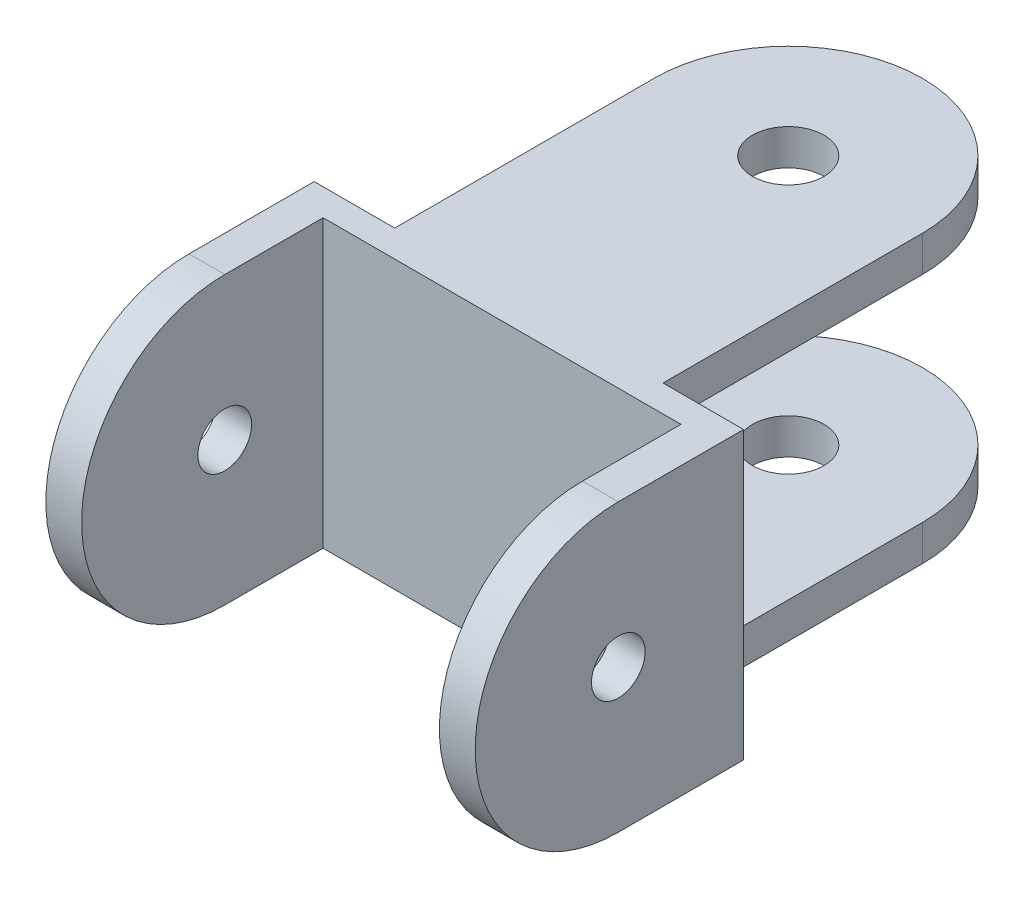
ISO-10303-21;
HEADER;
FILE_DESCRIPTION(('STEP AP214'),'2;1');
FILE_NAME('part.step','',(''),(''),'','','');
FILE_SCHEMA(('AUTOMOTIVE_DESIGN { 1 0 10303 214 1 1 1 1 }'));
ENDSEC;
DATA;
#1=APPLICATION_CONTEXT('core data for automotive mechanical design processes');
#2=APPLICATION_PROTOCOL_DEFINITION('international standard','automotive_design',2000,#1);
#3=PRODUCT_CONTEXT('',#1,'mechanical');
#4=PRODUCT('Part','Part','',(#3));
#5=PRODUCT_RELATED_PRODUCT_CATEGORY('part','',(#4));
#6=PRODUCT_DEFINITION_FORMATION('','',#4);
#7=PRODUCT_DEFINITION_CONTEXT('part definition',#1,'design');
#8=PRODUCT_DEFINITION('design','',#6,#7);
#9=PRODUCT_DEFINITION_SHAPE('','',#8);
#10=(LENGTH_UNIT() NAMED_UNIT(*) SI_UNIT(.MILLI.,.METRE.));
#11=(NAMED_UNIT(*) PLANE_ANGLE_UNIT() SI_UNIT($,.RADIAN.));
#12=(NAMED_UNIT(*) SI_UNIT($,.STERADIAN.) SOLID_ANGLE_UNIT());
#13=UNCERTAINTY_MEASURE_WITH_UNIT(LENGTH_MEASURE(1.E-05),#10,'distance_accuracy_value','');
#14=(GEOMETRIC_REPRESENTATION_CONTEXT(3) GLOBAL_UNCERTAINTY_ASSIGNED_CONTEXT((#13)) GLOBAL_UNIT_ASSIGNED_CONTEXT((#10,
#11,#12)) REPRESENTATION_CONTEXT('',''));
#15=CARTESIAN_POINT('',(0.,0.,0.));
#16=DIRECTION('',(0.,0.,1.));
#17=DIRECTION('',(1.,0.,0.));
#18=AXIS2_PLACEMENT_3D('',#15,#16,#17);
#19=CARTESIAN_POINT('',(-24.,0.,32.));
#20=DIRECTION('',(1.,0.,0.));
#21=DIRECTION('',(0.,1.,0.));
#22=AXIS2_PLACEMENT_3D('',#19,#20,#21);
#23=PLANE('',#22);
#24=CARTESIAN_POINT('',(-24.,-3.12033137055574E-13,43.));
#25=DIRECTION('',(-1.,0.,0.));
#26=DIRECTION('',(0.,-1.,0.));
#27=AXIS2_PLACEMENT_3D('',#24,#25,#26);
#28=CIRCLE('',#27,3.);
#29=CARTESIAN_POINT('',(-24.,-3.00000000000031,43.));
#30=VERTEX_POINT('',#29);
#31=EDGE_CURVE('E374',#30,#30,#28,.F.);
#32=ORIENTED_EDGE('',*,*,#31,.T.);
#33=EDGE_LOOP('',(#32));
#34=FACE_BOUND('',#33,.T.);
#35=DIRECTION('',(0.,0.,-1.));
#36=VECTOR('',#35,1.);
#37=CARTESIAN_POINT('',(-24.,-16.,32.));
#38=LINE('',#37,#36);
#39=CARTESIAN_POINT('',(-24.,-16.,43.));
#40=VERTEX_POINT('',#39);
#41=CARTESIAN_POINT('',(-24.,-16.,29.));
#42=VERTEX_POINT('',#41);
#43=EDGE_CURVE('E224',#40,#42,#38,.T.);
#44=ORIENTED_EDGE('',*,*,#43,.F.);
#45=CARTESIAN_POINT('',(-24.,-3.12033137055574E-13,43.));
#46=DIRECTION('',(-1.,0.,0.));
#47=DIRECTION('',(0.,-1.,0.));
#48=AXIS2_PLACEMENT_3D('',#45,#46,#47);
#49=CIRCLE('',#48,16.);
#50=CARTESIAN_POINT('',(-24.,16.,43.));
#51=VERTEX_POINT('',#50);
#52=EDGE_CURVE('E208',#51,#40,#49,.F.);
#53=ORIENTED_EDGE('',*,*,#52,.F.);
#54=DIRECTION('',(0.,0.,-1.));
#55=VECTOR('',#54,1.);
#56=CARTESIAN_POINT('',(-24.,16.,32.));
#57=LINE('',#56,#55);
#58=CARTESIAN_POINT('',(-24.,16.,29.));
#59=VERTEX_POINT('',#58);
#60=EDGE_CURVE('E226',#51,#59,#57,.T.);
#61=ORIENTED_EDGE('',*,*,#60,.T.);
#62=DIRECTION('',(0.,-1.,0.));
#63=VECTOR('',#62,1.);
#64=CARTESIAN_POINT('',(-24.,0.,29.));
#65=LINE('',#64,#63);
#66=EDGE_CURVE('E336',#59,#42,#65,.T.);
#67=ORIENTED_EDGE('',*,*,#66,.T.);
#68=EDGE_LOOP('',(#44,#53,#61,#67));
#69=FACE_BOUND('',#68,.T.);
#70=ADVANCED_FACE('F81',(#34,#69),#23,.F.);
#71=CARTESIAN_POINT('',(24.,0.,32.));
#72=DIRECTION('',(1.,0.,0.));
#73=DIRECTION('',(0.,1.,0.));
#74=AXIS2_PLACEMENT_3D('',#71,#72,#73);
#75=PLANE('',#74);
#76=CARTESIAN_POINT('',(24.,-3.01624796199713E-13,43.));
#77=DIRECTION('',(-1.,0.,0.));
#78=DIRECTION('',(0.,-1.,0.));
#79=AXIS2_PLACEMENT_3D('',#76,#77,#78);
#80=CIRCLE('',#79,3.);
#81=CARTESIAN_POINT('',(24.,-3.0000000000003,43.));
#82=VERTEX_POINT('',#81);
#83=EDGE_CURVE('E377',#82,#82,#80,.F.);
#84=ORIENTED_EDGE('',*,*,#83,.F.);
#85=EDGE_LOOP('',(#84));
#86=FACE_BOUND('',#85,.T.);
#87=CARTESIAN_POINT('',(24.,-3.01624796199713E-13,43.));
#88=DIRECTION('',(-1.,0.,0.));
#89=DIRECTION('',(0.,-1.,0.));
#90=AXIS2_PLACEMENT_3D('',#87,#88,#89);
#91=CIRCLE('',#90,16.);
#92=CARTESIAN_POINT('',(24.,16.,43.));
#93=VERTEX_POINT('',#92);
#94=CARTESIAN_POINT('',(24.,-16.,43.));
#95=VERTEX_POINT('',#94);
#96=EDGE_CURVE('E197',#93,#95,#91,.F.);
#97=ORIENTED_EDGE('',*,*,#96,.T.);
#98=DIRECTION('',(0.,0.,-1.));
#99=VECTOR('',#98,1.);
#100=CARTESIAN_POINT('',(24.,-16.,32.));
#101=LINE('',#100,#99);
#102=CARTESIAN_POINT('',(24.,-16.,29.));
#103=VERTEX_POINT('',#102);
#104=EDGE_CURVE('E202',#95,#103,#101,.T.);
#105=ORIENTED_EDGE('',*,*,#104,.T.);
#106=DIRECTION('',(0.,-1.,0.));
#107=VECTOR('',#106,1.);
#108=CARTESIAN_POINT('',(24.,0.,29.));
#109=LINE('',#108,#107);
#110=CARTESIAN_POINT('',(24.,16.,29.));
#111=VERTEX_POINT('',#110);
#112=EDGE_CURVE('E348',#111,#103,#109,.T.);
#113=ORIENTED_EDGE('',*,*,#112,.F.);
#114=DIRECTION('',(0.,0.,-1.));
#115=VECTOR('',#114,1.);
#116=CARTESIAN_POINT('',(24.,16.,32.));
#117=LINE('',#116,#115);
#118=EDGE_CURVE('E204',#93,#111,#117,.T.);
#119=ORIENTED_EDGE('',*,*,#118,.F.);
#120=EDGE_LOOP('',(#97,#105,#113,#119));
#121=FACE_BOUND('',#120,.T.);
#122=ADVANCED_FACE('F199',(#86,#121),#75,.T.);
#123=CARTESIAN_POINT('',(20.,0.,59.));
#124=DIRECTION('',(1.,0.,0.));
#125=DIRECTION('',(0.,1.,0.));
#126=AXIS2_PLACEMENT_3D('',#123,#124,#125);
#127=PLANE('',#126);
#128=CARTESIAN_POINT('',(20.,-3.02492157937702E-13,43.));
#129=DIRECTION('',(1.,0.,0.));
#130=DIRECTION('',(0.,1.,0.));
#131=AXIS2_PLACEMENT_3D('',#128,#129,#130);
#132=CIRCLE('',#131,3.);
#133=CARTESIAN_POINT('',(20.,-3.0000000000003,43.));
#134=VERTEX_POINT('',#133);
#135=EDGE_CURVE('E370',#134,#134,#132,.F.);
#136=ORIENTED_EDGE('',*,*,#135,.F.);
#137=EDGE_LOOP('',(#136));
#138=FACE_BOUND('',#137,.T.);
#139=DIRECTION('',(0.,0.,-1.));
#140=VECTOR('',#139,1.);
#141=CARTESIAN_POINT('',(20.,-16.,59.));
#142=LINE('',#141,#140);
#143=CARTESIAN_POINT('',(20.,-16.,43.));
#144=VERTEX_POINT('',#143);
#145=CARTESIAN_POINT('',(20.,-16.,32.));
#146=VERTEX_POINT('',#145);
#147=EDGE_CURVE('E357',#144,#146,#142,.T.);
#148=ORIENTED_EDGE('',*,*,#147,.F.);
#149=CARTESIAN_POINT('',(20.,-3.02492157937702E-13,43.));
#150=DIRECTION('',(1.,0.,0.));
#151=DIRECTION('',(0.,1.,0.));
#152=AXIS2_PLACEMENT_3D('',#149,#150,#151);
#153=CIRCLE('',#152,16.);
#154=CARTESIAN_POINT('',(20.,16.,43.));
#155=VERTEX_POINT('',#154);
#156=EDGE_CURVE('E214',#144,#155,#153,.F.);
#157=ORIENTED_EDGE('',*,*,#156,.T.);
#158=DIRECTION('',(0.,0.,-1.));
#159=VECTOR('',#158,1.);
#160=CARTESIAN_POINT('',(20.,16.,59.));
#161=LINE('',#160,#159);
#162=CARTESIAN_POINT('',(20.,16.,32.));
#163=VERTEX_POINT('',#162);
#164=EDGE_CURVE('E359',#155,#163,#161,.T.);
#165=ORIENTED_EDGE('',*,*,#164,.T.);
#166=DIRECTION('',(0.,1.,0.));
#167=VECTOR('',#166,1.);
#168=CARTESIAN_POINT('',(20.,0.,32.));
#169=LINE('',#168,#167);
#170=EDGE_CURVE('E12',#146,#163,#169,.T.);
#171=ORIENTED_EDGE('',*,*,#170,.F.);
#172=EDGE_LOOP('',(#148,#157,#165,#171));
#173=FACE_BOUND('',#172,.T.);
#174=ADVANCED_FACE('F392',(#138,#173),#127,.F.);
#175=CARTESIAN_POINT('',(-20.,0.,59.));
#176=DIRECTION('',(1.,0.,0.));
#177=DIRECTION('',(0.,1.,0.));
#178=AXIS2_PLACEMENT_3D('',#175,#176,#177);
#179=PLANE('',#178);
#180=CARTESIAN_POINT('',(-20.,-3.11165775317586E-13,43.));
#181=DIRECTION('',(1.,0.,0.));
#182=DIRECTION('',(0.,1.,0.));
#183=AXIS2_PLACEMENT_3D('',#180,#181,#182);
#184=CIRCLE('',#183,3.);
#185=CARTESIAN_POINT('',(-20.,-3.00000000000031,43.));
#186=VERTEX_POINT('',#185);
#187=EDGE_CURVE('E85',#186,#186,#184,.F.);
#188=ORIENTED_EDGE('',*,*,#187,.T.);
#189=EDGE_LOOP('',(#188));
#190=FACE_BOUND('',#189,.T.);
#191=CARTESIAN_POINT('',(-20.,-3.11165775317586E-13,43.));
#192=DIRECTION('',(1.,0.,0.));
#193=DIRECTION('',(0.,1.,0.));
#194=AXIS2_PLACEMENT_3D('',#191,#192,#193);
#195=CIRCLE('',#194,16.);
#196=CARTESIAN_POINT('',(-20.,-16.,43.));
#197=VERTEX_POINT('',#196);
#198=CARTESIAN_POINT('',(-20.,16.,43.));
#199=VERTEX_POINT('',#198);
#200=EDGE_CURVE('E366',#197,#199,#195,.F.);
#201=ORIENTED_EDGE('',*,*,#200,.F.);
#202=DIRECTION('',(0.,0.,-1.));
#203=VECTOR('',#202,1.);
#204=CARTESIAN_POINT('',(-20.,-16.,59.));
#205=LINE('',#204,#203);
#206=CARTESIAN_POINT('',(-20.,-16.,32.));
#207=VERTEX_POINT('',#206);
#208=EDGE_CURVE('E105',#197,#207,#205,.T.);
#209=ORIENTED_EDGE('',*,*,#208,.T.);
#210=DIRECTION('',(0.,1.,0.));
#211=VECTOR('',#210,1.);
#212=CARTESIAN_POINT('',(-20.,0.,32.));
#213=LINE('',#212,#211);
#214=CARTESIAN_POINT('',(-20.,16.,32.));
#215=VERTEX_POINT('',#214);
#216=EDGE_CURVE('E361',#207,#215,#213,.T.);
#217=ORIENTED_EDGE('',*,*,#216,.T.);
#218=DIRECTION('',(0.,0.,-1.));
#219=VECTOR('',#218,1.);
#220=CARTESIAN_POINT('',(-20.,16.,59.));
#221=LINE('',#220,#219);
#222=EDGE_CURVE('E97',#199,#215,#221,.T.);
#223=ORIENTED_EDGE('',*,*,#222,.F.);
#224=EDGE_LOOP('',(#201,#209,#217,#223));
#225=FACE_BOUND('',#224,.T.);
#226=ADVANCED_FACE('F387',(#190,#225),#179,.T.);
#227=CARTESIAN_POINT('',(15.,-16.,29.));
#228=DIRECTION('',(0.,1.,0.));
#229=DIRECTION('',(0.,0.,1.));
#230=AXIS2_PLACEMENT_3D('',#227,#228,#229);
#231=PLANE('',#230);
#232=CARTESIAN_POINT('',(0.,-16.,0.));
#233=DIRECTION('',(0.,1.,0.));
#234=DIRECTION('',(0.,0.,1.));
#235=AXIS2_PLACEMENT_3D('',#232,#233,#234);
#236=CIRCLE('',#235,4.);
#237=CARTESIAN_POINT('',(0.,-16.,4.));
#238=VERTEX_POINT('',#237);
#239=EDGE_CURVE('E234',#238,#238,#236,.T.);
#240=ORIENTED_EDGE('',*,*,#239,.T.);
#241=EDGE_LOOP('',(#240));
#242=FACE_BOUND('',#241,.T.);
#243=DIRECTION('',(-1.,0.,0.));
#244=VECTOR('',#243,1.);
#245=CARTESIAN_POINT('',(24.,-16.,43.));
#246=LINE('',#245,#244);
#247=EDGE_CURVE('E217',#197,#40,#246,.T.);
#248=ORIENTED_EDGE('',*,*,#247,.T.);
#249=ORIENTED_EDGE('',*,*,#43,.T.);
#250=DIRECTION('',(1.,0.,0.));
#251=VECTOR('',#250,1.);
#252=CARTESIAN_POINT('',(0.,-16.,29.));
#253=LINE('',#252,#251);
#254=CARTESIAN_POINT('',(-15.,-16.,29.));
#255=VERTEX_POINT('',#254);
#256=EDGE_CURVE('E332',#42,#255,#253,.T.);
#257=ORIENTED_EDGE('',*,*,#256,.T.);
#258=DIRECTION('',(0.,0.,-1.));
#259=VECTOR('',#258,1.);
#260=CARTESIAN_POINT('',(-15.,-16.,29.));
#261=LINE('',#260,#259);
#262=CARTESIAN_POINT('',(-15.,-16.,0.));
#263=VERTEX_POINT('',#262);
#264=EDGE_CURVE('E271',#255,#263,#261,.T.);
#265=ORIENTED_EDGE('',*,*,#264,.T.);
#266=CARTESIAN_POINT('',(0.,-16.,0.));
#267=DIRECTION('',(0.,1.,0.));
#268=DIRECTION('',(0.,0.,1.));
#269=AXIS2_PLACEMENT_3D('',#266,#267,#268);
#270=CIRCLE('',#269,15.);
#271=CARTESIAN_POINT('',(15.,-16.,0.));
#272=VERTEX_POINT('',#271);
#273=EDGE_CURVE('E240',#272,#263,#270,.T.);
#274=ORIENTED_EDGE('',*,*,#273,.F.);
#275=DIRECTION('',(0.,0.,-1.));
#276=VECTOR('',#275,1.);
#277=CARTESIAN_POINT('',(15.,-16.,29.));
#278=LINE('',#277,#276);
#279=CARTESIAN_POINT('',(15.,-16.,29.));
#280=VERTEX_POINT('',#279);
#281=EDGE_CURVE('E266',#280,#272,#278,.T.);
#282=ORIENTED_EDGE('',*,*,#281,.F.);
#283=EDGE_CURVE('E222',#280,#103,#253,.T.);
#284=ORIENTED_EDGE('',*,*,#283,.T.);
#285=ORIENTED_EDGE('',*,*,#104,.F.);
#286=EDGE_CURVE('E211',#95,#144,#246,.T.);
#287=ORIENTED_EDGE('',*,*,#286,.T.);
#288=ORIENTED_EDGE('',*,*,#147,.T.);
#289=DIRECTION('',(1.,0.,0.));
#290=VECTOR('',#289,1.);
#291=CARTESIAN_POINT('',(0.,-16.,32.));
#292=LINE('',#291,#290);
#293=EDGE_CURVE('E228',#207,#146,#292,.T.);
#294=ORIENTED_EDGE('',*,*,#293,.F.);
#295=ORIENTED_EDGE('',*,*,#208,.F.);
#296=EDGE_LOOP('',(#248,#249,#257,#265,#274,#282,#284,#285,#287,#288,#294,#295));
#297=FACE_BOUND('',#296,.T.);
#298=ADVANCED_FACE('F220',(#242,#297),#231,.F.);
#299=CARTESIAN_POINT('',(0.,16.,0.));
#300=DIRECTION('',(0.,1.,0.));
#301=DIRECTION('',(0.,0.,1.));
#302=AXIS2_PLACEMENT_3D('',#299,#300,#301);
#303=PLANE('',#302);
#304=CARTESIAN_POINT('',(0.,16.,0.));
#305=DIRECTION('',(0.,1.,0.));
#306=DIRECTION('',(0.,0.,1.));
#307=AXIS2_PLACEMENT_3D('',#304,#305,#306);
#308=CIRCLE('',#307,4.);
#309=CARTESIAN_POINT('',(0.,16.,4.));
#310=VERTEX_POINT('',#309);
#311=EDGE_CURVE('E274',#310,#310,#308,.T.);
#312=ORIENTED_EDGE('',*,*,#311,.F.);
#313=EDGE_LOOP('',(#312));
#314=FACE_BOUND('',#313,.T.);
#315=ORIENTED_EDGE('',*,*,#60,.F.);
#316=DIRECTION('',(-1.,0.,0.));
#317=VECTOR('',#316,1.);
#318=CARTESIAN_POINT('',(24.,16.,43.));
#319=LINE('',#318,#317);
#320=EDGE_CURVE('E207',#199,#51,#319,.T.);
#321=ORIENTED_EDGE('',*,*,#320,.F.);
#322=ORIENTED_EDGE('',*,*,#222,.T.);
#323=DIRECTION('',(1.,0.,0.));
#324=VECTOR('',#323,1.);
#325=CARTESIAN_POINT('',(0.,16.,32.));
#326=LINE('',#325,#324);
#327=EDGE_CURVE('E351',#215,#163,#326,.T.);
#328=ORIENTED_EDGE('',*,*,#327,.T.);
#329=ORIENTED_EDGE('',*,*,#164,.F.);
#330=EDGE_CURVE('E368',#93,#155,#319,.T.);
#331=ORIENTED_EDGE('',*,*,#330,.F.);
#332=ORIENTED_EDGE('',*,*,#118,.T.);
#333=DIRECTION('',(1.,0.,0.));
#334=VECTOR('',#333,1.);
#335=CARTESIAN_POINT('',(0.,16.,29.));
#336=LINE('',#335,#334);
#337=CARTESIAN_POINT('',(15.,16.,29.));
#338=VERTEX_POINT('',#337);
#339=EDGE_CURVE('E338',#338,#111,#336,.T.);
#340=ORIENTED_EDGE('',*,*,#339,.F.);
#341=DIRECTION('',(0.,0.,-1.));
#342=VECTOR('',#341,1.);
#343=CARTESIAN_POINT('',(15.,16.,25.));
#344=LINE('',#343,#342);
#345=CARTESIAN_POINT('',(15.,16.,0.));
#346=VERTEX_POINT('',#345);
#347=EDGE_CURVE('E287',#338,#346,#344,.T.);
#348=ORIENTED_EDGE('',*,*,#347,.T.);
#349=CARTESIAN_POINT('',(0.,16.,0.));
#350=DIRECTION('',(0.,1.,0.));
#351=DIRECTION('',(0.,0.,1.));
#352=AXIS2_PLACEMENT_3D('',#349,#350,#351);
#353=CIRCLE('',#352,15.);
#354=CARTESIAN_POINT('',(-15.,16.,0.));
#355=VERTEX_POINT('',#354);
#356=EDGE_CURVE('E280',#346,#355,#353,.T.);
#357=ORIENTED_EDGE('',*,*,#356,.T.);
#358=DIRECTION('',(0.,0.,1.));
#359=VECTOR('',#358,1.);
#360=CARTESIAN_POINT('',(-15.,16.,0.));
#361=LINE('',#360,#359);
#362=CARTESIAN_POINT('',(-15.,16.,29.));
#363=VERTEX_POINT('',#362);
#364=EDGE_CURVE('E283',#355,#363,#361,.T.);
#365=ORIENTED_EDGE('',*,*,#364,.T.);
#366=EDGE_CURVE('E334',#59,#363,#336,.T.);
#367=ORIENTED_EDGE('',*,*,#366,.F.);
#368=EDGE_LOOP('',(#315,#321,#322,#328,#329,#331,#332,#340,#348,#357,#365,#367));
#369=FACE_BOUND('',#368,.T.);
#370=ADVANCED_FACE('F340',(#314,#369),#303,.T.);
#371=CARTESIAN_POINT('',(0.,0.,32.));
#372=DIRECTION('',(0.,0.,1.));
#373=DIRECTION('',(1.,0.,0.));
#374=AXIS2_PLACEMENT_3D('',#371,#372,#373);
#375=PLANE('',#374);
#376=ORIENTED_EDGE('',*,*,#216,.F.);
#377=ORIENTED_EDGE('',*,*,#293,.T.);
#378=ORIENTED_EDGE('',*,*,#170,.T.);
#379=ORIENTED_EDGE('',*,*,#327,.F.);
#380=EDGE_LOOP('',(#376,#377,#378,#379));
#381=FACE_BOUND('',#380,.T.);
#382=ADVANCED_FACE('F389',(#381),#375,.T.);
#383=CARTESIAN_POINT('',(0.,12.,0.));
#384=DIRECTION('',(0.,1.,0.));
#385=DIRECTION('',(0.,0.,1.));
#386=AXIS2_PLACEMENT_3D('',#383,#384,#385);
#387=PLANE('',#386);
#388=CARTESIAN_POINT('',(0.,12.,0.));
#389=DIRECTION('',(0.,1.,0.));
#390=DIRECTION('',(0.,0.,1.));
#391=AXIS2_PLACEMENT_3D('',#388,#389,#390);
#392=CIRCLE('',#391,15.);
#393=CARTESIAN_POINT('',(15.,12.,0.));
#394=VERTEX_POINT('',#393);
#395=CARTESIAN_POINT('',(-15.,12.,0.));
#396=VERTEX_POINT('',#395);
#397=EDGE_CURVE('E277',#394,#396,#392,.T.);
#398=ORIENTED_EDGE('',*,*,#397,.F.);
#399=DIRECTION('',(0.,0.,-1.));
#400=VECTOR('',#399,1.);
#401=CARTESIAN_POINT('',(15.,12.,25.));
#402=LINE('',#401,#400);
#403=CARTESIAN_POINT('',(15.,12.,25.));
#404=VERTEX_POINT('',#403);
#405=EDGE_CURVE('E284',#404,#394,#402,.T.);
#406=ORIENTED_EDGE('',*,*,#405,.F.);
#407=DIRECTION('',(1.,0.,0.));
#408=VECTOR('',#407,1.);
#409=CARTESIAN_POINT('',(-15.,12.,25.));
#410=LINE('',#409,#408);
#411=CARTESIAN_POINT('',(-15.,12.,25.));
#412=VERTEX_POINT('',#411);
#413=EDGE_CURVE('E294',#412,#404,#410,.T.);
#414=ORIENTED_EDGE('',*,*,#413,.F.);
#415=DIRECTION('',(0.,0.,1.));
#416=VECTOR('',#415,1.);
#417=CARTESIAN_POINT('',(-15.,12.,0.));
#418=LINE('',#417,#416);
#419=EDGE_CURVE('E292',#396,#412,#418,.T.);
#420=ORIENTED_EDGE('',*,*,#419,.F.);
#421=EDGE_LOOP('',(#398,#406,#414,#420));
#422=FACE_BOUND('',#421,.T.);
#423=CARTESIAN_POINT('',(0.,12.,0.));
#424=DIRECTION('',(0.,1.,0.));
#425=DIRECTION('',(0.,0.,1.));
#426=AXIS2_PLACEMENT_3D('',#423,#424,#425);
#427=CIRCLE('',#426,4.);
#428=CARTESIAN_POINT('',(0.,12.,4.));
#429=VERTEX_POINT('',#428);
#430=EDGE_CURVE('E273',#429,#429,#427,.T.);
#431=ORIENTED_EDGE('',*,*,#430,.T.);
#432=EDGE_LOOP('',(#431));
#433=FACE_BOUND('',#432,.T.);
#434=ADVANCED_FACE('F312',(#422,#433),#387,.F.);
#435=CARTESIAN_POINT('',(0.,16.,0.));
#436=DIRECTION('',(0.,-1.,0.));
#437=DIRECTION('',(0.,0.,-1.));
#438=AXIS2_PLACEMENT_3D('',#435,#436,#437);
#439=CYLINDRICAL_SURFACE('',#438,15.);
#440=ORIENTED_EDGE('',*,*,#397,.T.);
#441=DIRECTION('',(0.,-1.,0.));
#442=VECTOR('',#441,1.);
#443=CARTESIAN_POINT('',(-15.,16.,0.));
#444=LINE('',#443,#442);
#445=EDGE_CURVE('E90',#355,#396,#444,.T.);
#446=ORIENTED_EDGE('',*,*,#445,.F.);
#447=ORIENTED_EDGE('',*,*,#356,.F.);
#448=DIRECTION('',(0.,-1.,0.));
#449=VECTOR('',#448,1.);
#450=CARTESIAN_POINT('',(15.,16.,0.));
#451=LINE('',#450,#449);
#452=EDGE_CURVE('E289',#346,#394,#451,.T.);
#453=ORIENTED_EDGE('',*,*,#452,.T.);
#454=EDGE_LOOP('',(#440,#446,#447,#453));
#455=FACE_BOUND('',#454,.T.);
#456=ADVANCED_FACE('F83',(#455),#439,.T.);
#457=CARTESIAN_POINT('',(-15.,16.,0.));
#458=DIRECTION('',(1.,0.,0.));
#459=DIRECTION('',(0.,0.,-1.));
#460=AXIS2_PLACEMENT_3D('',#457,#458,#459);
#461=PLANE('',#460);
#462=ORIENTED_EDGE('',*,*,#419,.T.);
#463=DIRECTION('',(0.,-1.,0.));
#464=VECTOR('',#463,1.);
#465=CARTESIAN_POINT('',(-15.,-16.,25.));
#466=LINE('',#465,#464);
#467=CARTESIAN_POINT('',(-15.,-12.,25.));
#468=VERTEX_POINT('',#467);
#469=EDGE_CURVE('E257',#412,#468,#466,.T.);
#470=ORIENTED_EDGE('',*,*,#469,.T.);
#471=DIRECTION('',(0.,0.,1.));
#472=VECTOR('',#471,1.);
#473=CARTESIAN_POINT('',(-15.,-12.,0.));
#474=LINE('',#473,#472);
#475=CARTESIAN_POINT('',(-15.,-12.,0.));
#476=VERTEX_POINT('',#475);
#477=EDGE_CURVE('E247',#476,#468,#474,.T.);
#478=ORIENTED_EDGE('',*,*,#477,.F.);
#479=DIRECTION('',(0.,1.,0.));
#480=VECTOR('',#479,1.);
#481=CARTESIAN_POINT('',(-15.,-16.,0.));
#482=LINE('',#481,#480);
#483=EDGE_CURVE('E243',#263,#476,#482,.T.);
#484=ORIENTED_EDGE('',*,*,#483,.F.);
#485=ORIENTED_EDGE('',*,*,#264,.F.);
#486=DIRECTION('',(0.,-1.,0.));
#487=VECTOR('',#486,1.);
#488=CARTESIAN_POINT('',(-15.,-16.,29.));
#489=LINE('',#488,#487);
#490=EDGE_CURVE('E259',#363,#255,#489,.T.);
#491=ORIENTED_EDGE('',*,*,#490,.F.);
#492=ORIENTED_EDGE('',*,*,#364,.F.);
#493=ORIENTED_EDGE('',*,*,#445,.T.);
#494=EDGE_LOOP('',(#462,#470,#478,#484,#485,#491,#492,#493));
#495=FACE_BOUND('',#494,.T.);
#496=ADVANCED_FACE('F303',(#495),#461,.F.);
#497=CARTESIAN_POINT('',(15.,16.,25.));
#498=DIRECTION('',(-1.,0.,0.));
#499=DIRECTION('',(0.,0.,1.));
#500=AXIS2_PLACEMENT_3D('',#497,#498,#499);
#501=PLANE('',#500);
#502=ORIENTED_EDGE('',*,*,#405,.T.);
#503=ORIENTED_EDGE('',*,*,#452,.F.);
#504=ORIENTED_EDGE('',*,*,#347,.F.);
#505=DIRECTION('',(0.,1.,0.));
#506=VECTOR('',#505,1.);
#507=CARTESIAN_POINT('',(15.,16.,29.));
#508=LINE('',#507,#506);
#509=EDGE_CURVE('E262',#280,#338,#508,.T.);
#510=ORIENTED_EDGE('',*,*,#509,.F.);
#511=ORIENTED_EDGE('',*,*,#281,.T.);
#512=DIRECTION('',(0.,1.,0.));
#513=VECTOR('',#512,1.);
#514=CARTESIAN_POINT('',(15.,-16.,0.));
#515=LINE('',#514,#513);
#516=CARTESIAN_POINT('',(15.,-12.,0.));
#517=VERTEX_POINT('',#516);
#518=EDGE_CURVE('E255',#272,#517,#515,.T.);
#519=ORIENTED_EDGE('',*,*,#518,.T.);
#520=DIRECTION('',(0.,0.,-1.));
#521=VECTOR('',#520,1.);
#522=CARTESIAN_POINT('',(15.,-12.,25.));
#523=LINE('',#522,#521);
#524=CARTESIAN_POINT('',(15.,-12.,25.));
#525=VERTEX_POINT('',#524);
#526=EDGE_CURVE('E244',#525,#517,#523,.T.);
#527=ORIENTED_EDGE('',*,*,#526,.F.);
#528=DIRECTION('',(0.,1.,0.));
#529=VECTOR('',#528,1.);
#530=CARTESIAN_POINT('',(15.,16.,25.));
#531=LINE('',#530,#529);
#532=EDGE_CURVE('E263',#525,#404,#531,.T.);
#533=ORIENTED_EDGE('',*,*,#532,.T.);
#534=EDGE_LOOP('',(#502,#503,#504,#510,#511,#519,#527,#533));
#535=FACE_BOUND('',#534,.T.);
#536=ADVANCED_FACE('F345',(#535),#501,.F.);
#537=CARTESIAN_POINT('',(0.,16.,0.));
#538=DIRECTION('',(0.,-1.,0.));
#539=DIRECTION('',(0.,0.,-1.));
#540=AXIS2_PLACEMENT_3D('',#537,#538,#539);
#541=CYLINDRICAL_SURFACE('',#540,4.);
#542=ORIENTED_EDGE('',*,*,#311,.T.);
#543=EDGE_LOOP('',(#542));
#544=FACE_BOUND('',#543,.T.);
#545=ORIENTED_EDGE('',*,*,#430,.F.);
#546=EDGE_LOOP('',(#545));
#547=FACE_BOUND('',#546,.T.);
#548=ADVANCED_FACE('F424',(#544,#547),#541,.F.);
#549=CARTESIAN_POINT('',(0.,0.,25.));
#550=DIRECTION('',(0.,0.,-1.));
#551=DIRECTION('',(-1.,0.,0.));
#552=AXIS2_PLACEMENT_3D('',#549,#550,#551);
#553=PLANE('',#552);
#554=DIRECTION('',(1.,0.,0.));
#555=VECTOR('',#554,1.);
#556=CARTESIAN_POINT('',(-15.,-12.,25.));
#557=LINE('',#556,#555);
#558=EDGE_CURVE('E250',#468,#525,#557,.T.);
#559=ORIENTED_EDGE('',*,*,#558,.F.);
#560=ORIENTED_EDGE('',*,*,#469,.F.);
#561=ORIENTED_EDGE('',*,*,#413,.T.);
#562=ORIENTED_EDGE('',*,*,#532,.F.);
#563=EDGE_LOOP('',(#559,#560,#561,#562));
#564=FACE_BOUND('',#563,.T.);
#565=ADVANCED_FACE('F316',(#564),#553,.T.);
#566=CARTESIAN_POINT('',(0.,-16.,0.));
#567=DIRECTION('',(0.,1.,0.));
#568=DIRECTION('',(0.,0.,1.));
#569=AXIS2_PLACEMENT_3D('',#566,#567,#568);
#570=CYLINDRICAL_SURFACE('',#569,15.);
#571=CARTESIAN_POINT('',(0.,-12.,0.));
#572=DIRECTION('',(0.,1.,0.));
#573=DIRECTION('',(0.,0.,1.));
#574=AXIS2_PLACEMENT_3D('',#571,#572,#573);
#575=CIRCLE('',#574,15.);
#576=EDGE_CURVE('E237',#517,#476,#575,.T.);
#577=ORIENTED_EDGE('',*,*,#576,.F.);
#578=ORIENTED_EDGE('',*,*,#518,.F.);
#579=ORIENTED_EDGE('',*,*,#273,.T.);
#580=ORIENTED_EDGE('',*,*,#483,.T.);
#581=EDGE_LOOP('',(#577,#578,#579,#580));
#582=FACE_BOUND('',#581,.T.);
#583=ADVANCED_FACE('F325',(#582),#570,.T.);
#584=CARTESIAN_POINT('',(0.,-12.,0.));
#585=DIRECTION('',(0.,1.,0.));
#586=DIRECTION('',(0.,0.,1.));
#587=AXIS2_PLACEMENT_3D('',#584,#585,#586);
#588=PLANE('',#587);
#589=CARTESIAN_POINT('',(0.,-12.,0.));
#590=DIRECTION('',(0.,1.,0.));
#591=DIRECTION('',(0.,0.,1.));
#592=AXIS2_PLACEMENT_3D('',#589,#590,#591);
#593=CIRCLE('',#592,4.);
#594=CARTESIAN_POINT('',(0.,-12.,4.));
#595=VERTEX_POINT('',#594);
#596=EDGE_CURVE('E233',#595,#595,#593,.T.);
#597=ORIENTED_EDGE('',*,*,#596,.F.);
#598=EDGE_LOOP('',(#597));
#599=FACE_BOUND('',#598,.T.);
#600=ORIENTED_EDGE('',*,*,#576,.T.);
#601=ORIENTED_EDGE('',*,*,#477,.T.);
#602=ORIENTED_EDGE('',*,*,#558,.T.);
#603=ORIENTED_EDGE('',*,*,#526,.T.);
#604=EDGE_LOOP('',(#600,#601,#602,#603));
#605=FACE_BOUND('',#604,.T.);
#606=ADVANCED_FACE('F320',(#599,#605),#588,.T.);
#607=CARTESIAN_POINT('',(0.,-16.,0.));
#608=DIRECTION('',(0.,1.,0.));
#609=DIRECTION('',(0.,0.,1.));
#610=AXIS2_PLACEMENT_3D('',#607,#608,#609);
#611=CYLINDRICAL_SURFACE('',#610,4.);
#612=ORIENTED_EDGE('',*,*,#239,.F.);
#613=EDGE_LOOP('',(#612));
#614=FACE_BOUND('',#613,.T.);
#615=ORIENTED_EDGE('',*,*,#596,.T.);
#616=EDGE_LOOP('',(#615));
#617=FACE_BOUND('',#616,.T.);
#618=ADVANCED_FACE('F413',(#614,#617),#611,.F.);
#619=CARTESIAN_POINT('',(0.,0.,29.));
#620=DIRECTION('',(0.,0.,1.));
#621=DIRECTION('',(1.,0.,0.));
#622=AXIS2_PLACEMENT_3D('',#619,#620,#621);
#623=PLANE('',#622);
#624=ORIENTED_EDGE('',*,*,#490,.T.);
#625=ORIENTED_EDGE('',*,*,#256,.F.);
#626=ORIENTED_EDGE('',*,*,#66,.F.);
#627=ORIENTED_EDGE('',*,*,#366,.T.);
#628=EDGE_LOOP('',(#624,#625,#626,#627));
#629=FACE_BOUND('',#628,.T.);
#630=ADVANCED_FACE('F330',(#629),#623,.F.);
#631=ORIENTED_EDGE('',*,*,#112,.T.);
#632=ORIENTED_EDGE('',*,*,#283,.F.);
#633=ORIENTED_EDGE('',*,*,#509,.T.);
#634=ORIENTED_EDGE('',*,*,#339,.T.);
#635=EDGE_LOOP('',(#631,#632,#633,#634));
#636=FACE_BOUND('',#635,.T.);
#637=ADVANCED_FACE('F347',(#636),#623,.F.);
#638=CARTESIAN_POINT('',(24.,-3.01624796199713E-13,43.));
#639=DIRECTION('',(-1.,0.,0.));
#640=DIRECTION('',(0.,-1.,0.));
#641=AXIS2_PLACEMENT_3D('',#638,#639,#640);
#642=CYLINDRICAL_SURFACE('',#641,16.);
#643=ORIENTED_EDGE('',*,*,#200,.T.);
#644=ORIENTED_EDGE('',*,*,#320,.T.);
#645=ORIENTED_EDGE('',*,*,#52,.T.);
#646=ORIENTED_EDGE('',*,*,#247,.F.);
#647=EDGE_LOOP('',(#643,#644,#645,#646));
#648=FACE_BOUND('',#647,.T.);
#649=ADVANCED_FACE('F496',(#648),#642,.T.);
#650=ORIENTED_EDGE('',*,*,#156,.F.);
#651=ORIENTED_EDGE('',*,*,#286,.F.);
#652=ORIENTED_EDGE('',*,*,#96,.F.);
#653=ORIENTED_EDGE('',*,*,#330,.T.);
#654=EDGE_LOOP('',(#650,#651,#652,#653));
#655=FACE_BOUND('',#654,.T.);
#656=ADVANCED_FACE('F212',(#655),#642,.T.);
#657=CARTESIAN_POINT('',(24.,-3.01624796199713E-13,43.));
#658=DIRECTION('',(-1.,0.,0.));
#659=DIRECTION('',(0.,-1.,0.));
#660=AXIS2_PLACEMENT_3D('',#657,#658,#659);
#661=CYLINDRICAL_SURFACE('',#660,3.);
#662=CARTESIAN_POINT('',(-20.,-3.00000000000031,43.));
#663=CARTESIAN_POINT('',(-20.0416666666667,-3.00000000000031,43.));
#664=CARTESIAN_POINT('',(-20.0833333333333,-3.00000000000031,43.));
#665=CARTESIAN_POINT('',(-20.1666666666667,-3.00000000000031,43.));
#666=CARTESIAN_POINT('',(-20.2083333333333,-3.00000000000031,43.));
#667=CARTESIAN_POINT('',(-20.2916666666667,-3.00000000000031,43.));
#668=CARTESIAN_POINT('',(-20.3333333333333,-3.00000000000031,43.));
#669=CARTESIAN_POINT('',(-20.4166666666667,-3.00000000000031,43.));
#670=CARTESIAN_POINT('',(-20.4583333333333,-3.00000000000031,43.));
#671=CARTESIAN_POINT('',(-20.5416666666667,-3.00000000000031,43.));
#672=CARTESIAN_POINT('',(-20.5833333333333,-3.00000000000031,43.));
#673=CARTESIAN_POINT('',(-20.6666666666667,-3.00000000000031,43.));
#674=CARTESIAN_POINT('',(-20.7083333333333,-3.00000000000031,43.));
#675=CARTESIAN_POINT('',(-20.7916666666667,-3.00000000000031,43.));
#676=CARTESIAN_POINT('',(-20.8333333333333,-3.00000000000031,43.));
#677=CARTESIAN_POINT('',(-20.9166666666667,-3.00000000000031,43.));
#678=CARTESIAN_POINT('',(-20.9583333333333,-3.00000000000031,43.));
#679=CARTESIAN_POINT('',(-21.0416666666667,-3.00000000000031,43.));
#680=CARTESIAN_POINT('',(-21.0833333333333,-3.00000000000031,43.));
#681=CARTESIAN_POINT('',(-21.1666666666667,-3.00000000000031,43.));
#682=CARTESIAN_POINT('',(-21.2083333333333,-3.00000000000031,43.));
#683=CARTESIAN_POINT('',(-21.2916666666667,-3.00000000000031,43.));
#684=CARTESIAN_POINT('',(-21.3333333333333,-3.00000000000031,43.));
#685=CARTESIAN_POINT('',(-21.4166666666667,-3.00000000000031,43.));
#686=CARTESIAN_POINT('',(-21.4583333333333,-3.00000000000031,43.));
#687=CARTESIAN_POINT('',(-21.5416666666667,-3.00000000000031,43.));
#688=CARTESIAN_POINT('',(-21.5833333333333,-3.00000000000031,43.));
#689=CARTESIAN_POINT('',(-21.6666666666667,-3.00000000000031,43.));
#690=CARTESIAN_POINT('',(-21.7083333333333,-3.00000000000031,43.));
#691=CARTESIAN_POINT('',(-21.7916666666667,-3.00000000000031,43.));
#692=CARTESIAN_POINT('',(-21.8333333333333,-3.00000000000031,43.));
#693=CARTESIAN_POINT('',(-21.9166666666667,-3.00000000000031,43.));
#694=CARTESIAN_POINT('',(-21.9583333333333,-3.00000000000031,43.));
#695=CARTESIAN_POINT('',(-22.0416666666667,-3.00000000000031,43.));
#696=CARTESIAN_POINT('',(-22.0833333333333,-3.00000000000031,43.));
#697=CARTESIAN_POINT('',(-22.1666666666667,-3.00000000000031,43.));
#698=CARTESIAN_POINT('',(-22.2083333333333,-3.00000000000031,43.));
#699=CARTESIAN_POINT('',(-22.2916666666667,-3.00000000000031,43.));
#700=CARTESIAN_POINT('',(-22.3333333333333,-3.00000000000031,43.));
#701=CARTESIAN_POINT('',(-22.4166666666667,-3.00000000000031,43.));
#702=CARTESIAN_POINT('',(-22.4583333333333,-3.00000000000031,43.));
#703=CARTESIAN_POINT('',(-22.5416666666667,-3.00000000000031,43.));
#704=CARTESIAN_POINT('',(-22.5833333333333,-3.00000000000031,43.));
#705=CARTESIAN_POINT('',(-22.6666666666667,-3.00000000000031,43.));
#706=CARTESIAN_POINT('',(-22.7083333333333,-3.00000000000031,43.));
#707=CARTESIAN_POINT('',(-22.7916666666667,-3.00000000000031,43.));
#708=CARTESIAN_POINT('',(-22.8333333333333,-3.00000000000031,43.));
#709=CARTESIAN_POINT('',(-22.9166666666667,-3.00000000000031,43.));
#710=CARTESIAN_POINT('',(-22.9583333333333,-3.00000000000031,43.));
#711=CARTESIAN_POINT('',(-23.0416666666667,-3.00000000000031,43.));
#712=CARTESIAN_POINT('',(-23.0833333333333,-3.00000000000031,43.));
#713=CARTESIAN_POINT('',(-23.1666666666667,-3.00000000000031,43.));
#714=CARTESIAN_POINT('',(-23.2083333333333,-3.00000000000031,43.));
#715=CARTESIAN_POINT('',(-23.2916666666667,-3.00000000000031,43.));
#716=CARTESIAN_POINT('',(-23.3333333333333,-3.00000000000031,43.));
#717=CARTESIAN_POINT('',(-23.4166666666667,-3.00000000000031,43.));
#718=CARTESIAN_POINT('',(-23.4583333333333,-3.00000000000031,43.));
#719=CARTESIAN_POINT('',(-23.5416666666667,-3.00000000000031,43.));
#720=CARTESIAN_POINT('',(-23.5833333333333,-3.00000000000031,43.));
#721=CARTESIAN_POINT('',(-23.6666666666667,-3.00000000000031,43.));
#722=CARTESIAN_POINT('',(-23.7083333333333,-3.00000000000031,43.));
#723=CARTESIAN_POINT('',(-23.7916666666667,-3.00000000000031,43.));
#724=CARTESIAN_POINT('',(-23.8333333333333,-3.00000000000031,43.));
#725=CARTESIAN_POINT('',(-23.9166666666667,-3.00000000000031,43.));
#726=CARTESIAN_POINT('',(-23.9583333333333,-3.00000000000031,43.));
#727=CARTESIAN_POINT('',(-24.,-3.00000000000031,43.));
#728=B_SPLINE_CURVE_WITH_KNOTS('',3,(#662,#663,#664,#665,#666,#667,#668,#669,#670,#671,#672,
#673,#674,#675,#676,#677,#678,#679,#680,#681,#682,#683,#684,#685,#686,#687,#688,#689,#690,#691,
#692,#693,#694,#695,#696,#697,#698,#699,#700,#701,#702,#703,#704,#705,#706,#707,#708,#709,#710,
#711,#712,#713,#714,#715,#716,#717,#718,#719,#720,#721,#722,#723,#724,#725,#726,#727),
.UNSPECIFIED.,.F.,.F.,(4,2,2,2,2,2,2,2,2,2,2,2,2,2,2,2,2,2,2,2,2,2,2,2,2,2,2,2,2,2,2,2,4),(0.,
0.125,0.25,0.375,0.5,0.625000000000001,0.750000000000001,0.875000000000001,1.,1.125,1.25,1.375,
1.5,1.625,1.75,1.875,2.,2.125,2.25,2.375,2.5,2.625,2.75,2.875,3.,3.125,3.25,3.375,3.5,3.625,
3.75,3.875,4.),.UNSPECIFIED.);
#729=EDGE_CURVE('BSEAM622',#186,#30,#728,.T.);
#730=ORIENTED_EDGE('',*,*,#187,.F.);
#731=ORIENTED_EDGE('',*,*,#31,.F.);
#732=ORIENTED_EDGE('',*,*,#729,.T.);
#733=ORIENTED_EDGE('',*,*,#729,.F.);
#734=EDGE_LOOP('',(#730,#732,#731,#733));
#735=FACE_BOUND('',#734,.T.);
#736=ADVANCED_FACE('F622',(#735),#661,.F.);
#737=CARTESIAN_POINT('',(24.,-3.0000000000003,43.));
#738=CARTESIAN_POINT('',(23.9583333333333,-3.0000000000003,43.));
#739=CARTESIAN_POINT('',(23.9166666666667,-3.0000000000003,43.));
#740=CARTESIAN_POINT('',(23.8333333333333,-3.0000000000003,43.));
#741=CARTESIAN_POINT('',(23.7916666666667,-3.0000000000003,43.));
#742=CARTESIAN_POINT('',(23.7083333333333,-3.0000000000003,43.));
#743=CARTESIAN_POINT('',(23.6666666666667,-3.0000000000003,43.));
#744=CARTESIAN_POINT('',(23.5833333333333,-3.0000000000003,43.));
#745=CARTESIAN_POINT('',(23.5416666666667,-3.0000000000003,43.));
#746=CARTESIAN_POINT('',(23.4583333333333,-3.0000000000003,43.));
#747=CARTESIAN_POINT('',(23.4166666666667,-3.0000000000003,43.));
#748=CARTESIAN_POINT('',(23.3333333333333,-3.0000000000003,43.));
#749=CARTESIAN_POINT('',(23.2916666666667,-3.0000000000003,43.));
#750=CARTESIAN_POINT('',(23.2083333333333,-3.0000000000003,43.));
#751=CARTESIAN_POINT('',(23.1666666666667,-3.0000000000003,43.));
#752=CARTESIAN_POINT('',(23.0833333333333,-3.0000000000003,43.));
#753=CARTESIAN_POINT('',(23.0416666666667,-3.0000000000003,43.));
#754=CARTESIAN_POINT('',(22.9583333333333,-3.0000000000003,43.));
#755=CARTESIAN_POINT('',(22.9166666666667,-3.0000000000003,43.));
#756=CARTESIAN_POINT('',(22.8333333333333,-3.0000000000003,43.));
#757=CARTESIAN_POINT('',(22.7916666666667,-3.0000000000003,43.));
#758=CARTESIAN_POINT('',(22.7083333333333,-3.0000000000003,43.));
#759=CARTESIAN_POINT('',(22.6666666666667,-3.0000000000003,43.));
#760=CARTESIAN_POINT('',(22.5833333333333,-3.0000000000003,43.));
#761=CARTESIAN_POINT('',(22.5416666666667,-3.0000000000003,43.));
#762=CARTESIAN_POINT('',(22.4583333333333,-3.0000000000003,43.));
#763=CARTESIAN_POINT('',(22.4166666666667,-3.0000000000003,43.));
#764=CARTESIAN_POINT('',(22.3333333333333,-3.0000000000003,43.));
#765=CARTESIAN_POINT('',(22.2916666666667,-3.0000000000003,43.));
#766=CARTESIAN_POINT('',(22.2083333333333,-3.0000000000003,43.));
#767=CARTESIAN_POINT('',(22.1666666666667,-3.0000000000003,43.));
#768=CARTESIAN_POINT('',(22.0833333333333,-3.0000000000003,43.));
#769=CARTESIAN_POINT('',(22.0416666666667,-3.0000000000003,43.));
#770=CARTESIAN_POINT('',(21.9583333333333,-3.0000000000003,43.));
#771=CARTESIAN_POINT('',(21.9166666666667,-3.0000000000003,43.));
#772=CARTESIAN_POINT('',(21.8333333333333,-3.0000000000003,43.));
#773=CARTESIAN_POINT('',(21.7916666666667,-3.0000000000003,43.));
#774=CARTESIAN_POINT('',(21.7083333333333,-3.0000000000003,43.));
#775=CARTESIAN_POINT('',(21.6666666666667,-3.0000000000003,43.));
#776=CARTESIAN_POINT('',(21.5833333333333,-3.0000000000003,43.));
#777=CARTESIAN_POINT('',(21.5416666666667,-3.0000000000003,43.));
#778=CARTESIAN_POINT('',(21.4583333333333,-3.0000000000003,43.));
#779=CARTESIAN_POINT('',(21.4166666666667,-3.0000000000003,43.));
#780=CARTESIAN_POINT('',(21.3333333333333,-3.0000000000003,43.));
#781=CARTESIAN_POINT('',(21.2916666666667,-3.0000000000003,43.));
#782=CARTESIAN_POINT('',(21.2083333333333,-3.0000000000003,43.));
#783=CARTESIAN_POINT('',(21.1666666666667,-3.0000000000003,43.));
#784=CARTESIAN_POINT('',(21.0833333333333,-3.0000000000003,43.));
#785=CARTESIAN_POINT('',(21.0416666666667,-3.0000000000003,43.));
#786=CARTESIAN_POINT('',(20.9583333333333,-3.0000000000003,43.));
#787=CARTESIAN_POINT('',(20.9166666666667,-3.0000000000003,43.));
#788=CARTESIAN_POINT('',(20.8333333333333,-3.0000000000003,43.));
#789=CARTESIAN_POINT('',(20.7916666666667,-3.0000000000003,43.));
#790=CARTESIAN_POINT('',(20.7083333333333,-3.0000000000003,43.));
#791=CARTESIAN_POINT('',(20.6666666666667,-3.0000000000003,43.));
#792=CARTESIAN_POINT('',(20.5833333333333,-3.0000000000003,43.));
#793=CARTESIAN_POINT('',(20.5416666666667,-3.0000000000003,43.));
#794=CARTESIAN_POINT('',(20.4583333333333,-3.0000000000003,43.));
#795=CARTESIAN_POINT('',(20.4166666666667,-3.0000000000003,43.));
#796=CARTESIAN_POINT('',(20.3333333333333,-3.0000000000003,43.));
#797=CARTESIAN_POINT('',(20.2916666666667,-3.0000000000003,43.));
#798=CARTESIAN_POINT('',(20.2083333333333,-3.0000000000003,43.));
#799=CARTESIAN_POINT('',(20.1666666666667,-3.0000000000003,43.));
#800=CARTESIAN_POINT('',(20.0833333333333,-3.0000000000003,43.));
#801=CARTESIAN_POINT('',(20.0416666666667,-3.0000000000003,43.));
#802=CARTESIAN_POINT('',(20.,-3.0000000000003,43.));
#803=B_SPLINE_CURVE_WITH_KNOTS('',3,(#737,#738,#739,#740,#741,#742,#743,#744,#745,#746,#747,
#748,#749,#750,#751,#752,#753,#754,#755,#756,#757,#758,#759,#760,#761,#762,#763,#764,#765,#766,
#767,#768,#769,#770,#771,#772,#773,#774,#775,#776,#777,#778,#779,#780,#781,#782,#783,#784,#785,
#786,#787,#788,#789,#790,#791,#792,#793,#794,#795,#796,#797,#798,#799,#800,#801,#802),
.UNSPECIFIED.,.F.,.F.,(4,2,2,2,2,2,2,2,2,2,2,2,2,2,2,2,2,2,2,2,2,2,2,2,2,2,2,2,2,2,2,2,4),(0.,
0.125,0.25,0.375,0.5,0.625000000000001,0.750000000000001,0.875000000000001,1.,1.125,1.25,1.375,
1.5,1.625,1.75000000000001,1.87500000000001,2.00000000000001,2.12500000000001,2.25000000000001,
2.37500000000001,2.50000000000001,2.62500000000001,2.75000000000001,2.87500000000001,
3.00000000000001,3.12500000000001,3.25000000000001,3.37500000000001,3.50000000000001,
3.62500000000001,3.75000000000002,3.87500000000002,4.00000000000002),.UNSPECIFIED.);
#804=EDGE_CURVE('BSEAM630',#82,#134,#803,.T.);
#805=ORIENTED_EDGE('',*,*,#83,.T.);
#806=ORIENTED_EDGE('',*,*,#135,.T.);
#807=ORIENTED_EDGE('',*,*,#804,.T.);
#808=ORIENTED_EDGE('',*,*,#804,.F.);
#809=EDGE_LOOP('',(#805,#807,#806,#808));
#810=FACE_BOUND('',#809,.T.);
#811=ADVANCED_FACE('F630',(#810),#661,.F.);
#812=CLOSED_SHELL('',(#70,#122,#174,#226,#298,#370,#382,#434,#456,#496,#536,#548,#565,#583,#606,
#618,#630,#637,#649,#656,#736,#811));
#813=MANIFOLD_SOLID_BREP('B2',#812);
#814=ADVANCED_BREP_SHAPE_REPRESENTATION('',(#18,#813),#14);
#815=SHAPE_DEFINITION_REPRESENTATION(#9,#814);
ENDSEC;
END-ISO-10303-21;
